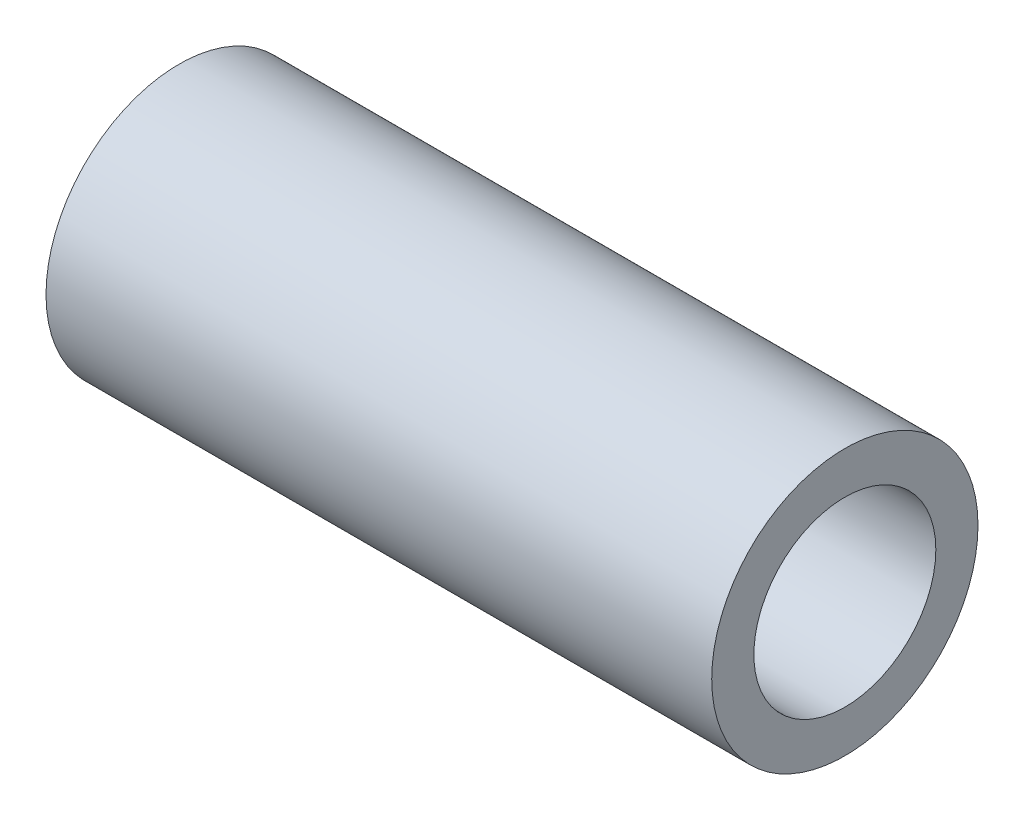
ISO-10303-21;
HEADER;
FILE_DESCRIPTION(('STEP AP214'),'2;1');
FILE_NAME('part.step','',(''),(''),'','','');
FILE_SCHEMA(('AUTOMOTIVE_DESIGN { 1 0 10303 214 1 1 1 1 }'));
ENDSEC;
DATA;
#1=APPLICATION_CONTEXT('core data for automotive mechanical design processes');
#2=APPLICATION_PROTOCOL_DEFINITION('international standard','automotive_design',2000,#1);
#3=PRODUCT_CONTEXT('',#1,'mechanical');
#4=PRODUCT('Part','Part','',(#3));
#5=PRODUCT_RELATED_PRODUCT_CATEGORY('part','',(#4));
#6=PRODUCT_DEFINITION_FORMATION('','',#4);
#7=PRODUCT_DEFINITION_CONTEXT('part definition',#1,'design');
#8=PRODUCT_DEFINITION('design','',#6,#7);
#9=PRODUCT_DEFINITION_SHAPE('','',#8);
#10=(LENGTH_UNIT() NAMED_UNIT(*) SI_UNIT(.MILLI.,.METRE.));
#11=(NAMED_UNIT(*) PLANE_ANGLE_UNIT() SI_UNIT($,.RADIAN.));
#12=(NAMED_UNIT(*) SI_UNIT($,.STERADIAN.) SOLID_ANGLE_UNIT());
#13=UNCERTAINTY_MEASURE_WITH_UNIT(LENGTH_MEASURE(1.E-05),#10,'distance_accuracy_value','');
#14=(GEOMETRIC_REPRESENTATION_CONTEXT(3) GLOBAL_UNCERTAINTY_ASSIGNED_CONTEXT((#13)) GLOBAL_UNIT_ASSIGNED_CONTEXT((#10,
#11,#12)) REPRESENTATION_CONTEXT('',''));
#15=CARTESIAN_POINT('',(0.,0.,0.));
#16=DIRECTION('',(0.,0.,1.));
#17=DIRECTION('',(1.,0.,0.));
#18=AXIS2_PLACEMENT_3D('',#15,#16,#17);
#19=CARTESIAN_POINT('',(30.,0.,0.));
#20=DIRECTION('',(1.,0.,0.));
#21=DIRECTION('',(0.,0.,-1.));
#22=AXIS2_PLACEMENT_3D('',#19,#20,#21);
#23=PLANE('',#22);
#24=CARTESIAN_POINT('',(30.,0.,0.));
#25=DIRECTION('',(1.,0.,0.));
#26=DIRECTION('',(0.,0.,-1.));
#27=AXIS2_PLACEMENT_3D('',#24,#25,#26);
#28=CIRCLE('',#27,6.);
#29=CARTESIAN_POINT('',(30.,0.,-6.));
#30=VERTEX_POINT('',#29);
#31=EDGE_CURVE('E10',#30,#30,#28,.T.);
#32=ORIENTED_EDGE('',*,*,#31,.T.);
#33=EDGE_LOOP('',(#32));
#34=FACE_BOUND('',#33,.T.);
#35=CARTESIAN_POINT('',(30.,0.,0.));
#36=DIRECTION('',(1.,0.,0.));
#37=DIRECTION('',(0.,0.,-1.));
#38=AXIS2_PLACEMENT_3D('',#35,#36,#37);
#39=CIRCLE('',#38,4.1);
#40=CARTESIAN_POINT('',(30.,0.,-4.1));
#41=VERTEX_POINT('',#40);
#42=EDGE_CURVE('E48',#41,#41,#39,.T.);
#43=ORIENTED_EDGE('',*,*,#42,.F.);
#44=EDGE_LOOP('',(#43));
#45=FACE_BOUND('',#44,.T.);
#46=ADVANCED_FACE('F40',(#34,#45),#23,.T.);
#47=CARTESIAN_POINT('',(0.,0.,0.));
#48=DIRECTION('',(1.,0.,0.));
#49=DIRECTION('',(0.,0.,-1.));
#50=AXIS2_PLACEMENT_3D('',#47,#48,#49);
#51=PLANE('',#50);
#52=CARTESIAN_POINT('',(0.,0.,0.));
#53=DIRECTION('',(1.,0.,0.));
#54=DIRECTION('',(0.,0.,-1.));
#55=AXIS2_PLACEMENT_3D('',#52,#53,#54);
#56=CIRCLE('',#55,6.);
#57=CARTESIAN_POINT('',(0.,0.,-6.));
#58=VERTEX_POINT('',#57);
#59=EDGE_CURVE('E41',#58,#58,#56,.T.);
#60=ORIENTED_EDGE('',*,*,#59,.F.);
#61=EDGE_LOOP('',(#60));
#62=FACE_BOUND('',#61,.T.);
#63=CARTESIAN_POINT('',(0.,0.,0.));
#64=DIRECTION('',(1.,0.,0.));
#65=DIRECTION('',(0.,0.,-1.));
#66=AXIS2_PLACEMENT_3D('',#63,#64,#65);
#67=CIRCLE('',#66,4.1);
#68=CARTESIAN_POINT('',(0.,0.,-4.1));
#69=VERTEX_POINT('',#68);
#70=EDGE_CURVE('E49',#69,#69,#67,.T.);
#71=ORIENTED_EDGE('',*,*,#70,.T.);
#72=EDGE_LOOP('',(#71));
#73=FACE_BOUND('',#72,.T.);
#74=ADVANCED_FACE('F58',(#62,#73),#51,.F.);
#75=CARTESIAN_POINT('',(30.,0.,0.));
#76=DIRECTION('',(-1.,0.,0.));
#77=DIRECTION('',(0.,0.,1.));
#78=AXIS2_PLACEMENT_3D('',#75,#76,#77);
#79=CYLINDRICAL_SURFACE('',#78,6.);
#80=ORIENTED_EDGE('',*,*,#31,.F.);
#81=EDGE_LOOP('',(#80));
#82=FACE_BOUND('',#81,.T.);
#83=ORIENTED_EDGE('',*,*,#59,.T.);
#84=EDGE_LOOP('',(#83));
#85=FACE_BOUND('',#84,.T.);
#86=ADVANCED_FACE('F39',(#82,#85),#79,.T.);
#87=CARTESIAN_POINT('',(30.,0.,0.));
#88=DIRECTION('',(-1.,0.,0.));
#89=DIRECTION('',(0.,0.,1.));
#90=AXIS2_PLACEMENT_3D('',#87,#88,#89);
#91=CYLINDRICAL_SURFACE('',#90,4.1);
#92=ORIENTED_EDGE('',*,*,#42,.T.);
#93=EDGE_LOOP('',(#92));
#94=FACE_BOUND('',#93,.T.);
#95=ORIENTED_EDGE('',*,*,#70,.F.);
#96=EDGE_LOOP('',(#95));
#97=FACE_BOUND('',#96,.T.);
#98=ADVANCED_FACE('F57',(#94,#97),#91,.F.);
#99=CLOSED_SHELL('',(#46,#74,#86,#98));
#100=MANIFOLD_SOLID_BREP('B2',#99);
#101=ADVANCED_BREP_SHAPE_REPRESENTATION('',(#18,#100),#14);
#102=SHAPE_DEFINITION_REPRESENTATION(#9,#101);
ENDSEC;
END-ISO-10303-21;
